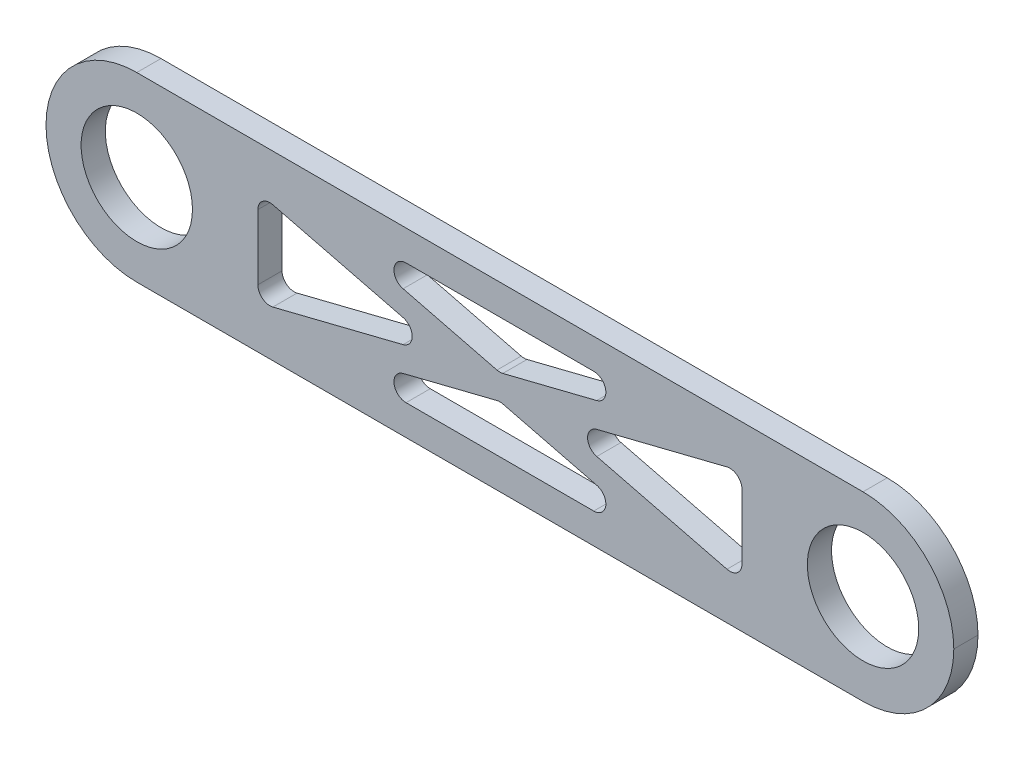
ISO-10303-21;
HEADER;
FILE_DESCRIPTION(('STEP AP214'),'2;1');
FILE_NAME('part.step','',(''),(''),'','','');
FILE_SCHEMA(('AUTOMOTIVE_DESIGN { 1 0 10303 214 1 1 1 1 }'));
ENDSEC;
DATA;
#1=APPLICATION_CONTEXT('core data for automotive mechanical design processes');
#2=APPLICATION_PROTOCOL_DEFINITION('international standard','automotive_design',2000,#1);
#3=PRODUCT_CONTEXT('',#1,'mechanical');
#4=PRODUCT('Part','Part','',(#3));
#5=PRODUCT_RELATED_PRODUCT_CATEGORY('part','',(#4));
#6=PRODUCT_DEFINITION_FORMATION('','',#4);
#7=PRODUCT_DEFINITION_CONTEXT('part definition',#1,'design');
#8=PRODUCT_DEFINITION('design','',#6,#7);
#9=PRODUCT_DEFINITION_SHAPE('','',#8);
#10=(LENGTH_UNIT() NAMED_UNIT(*) SI_UNIT(.MILLI.,.METRE.));
#11=(NAMED_UNIT(*) PLANE_ANGLE_UNIT() SI_UNIT($,.RADIAN.));
#12=(NAMED_UNIT(*) SI_UNIT($,.STERADIAN.) SOLID_ANGLE_UNIT());
#13=UNCERTAINTY_MEASURE_WITH_UNIT(LENGTH_MEASURE(1.E-05),#10,'distance_accuracy_value','');
#14=(GEOMETRIC_REPRESENTATION_CONTEXT(3) GLOBAL_UNCERTAINTY_ASSIGNED_CONTEXT((#13)) GLOBAL_UNIT_ASSIGNED_CONTEXT((#10,
#11,#12)) REPRESENTATION_CONTEXT('',''));
#15=CARTESIAN_POINT('',(0.,0.,0.));
#16=DIRECTION('',(0.,0.,1.));
#17=DIRECTION('',(1.,0.,0.));
#18=AXIS2_PLACEMENT_3D('',#15,#16,#17);
#19=CARTESIAN_POINT('',(0.,0.,-2.));
#20=DIRECTION('',(0.,0.,1.));
#21=DIRECTION('',(-1.,0.,0.));
#22=AXIS2_PLACEMENT_3D('',#19,#20,#21);
#23=PLANE('',#22);
#24=DIRECTION('',(0.970142500145332,0.242535625036333,0.));
#25=VECTOR('',#24,1.);
#26=CARTESIAN_POINT('',(-0.242535625036334,0.970142500145335,-2.));
#27=LINE('',#26,#25);
#28=CARTESIAN_POINT('',(-18.7574643749637,-3.6585896873365,-2.));
#29=VERTEX_POINT('',#28);
#30=CARTESIAN_POINT('',(-8.003675626199,-0.970142500145333,-2.));
#31=VERTEX_POINT('',#30);
#32=EDGE_CURVE('E601',#29,#31,#27,.T.);
#33=ORIENTED_EDGE('',*,*,#32,.T.);
#34=CARTESIAN_POINT('',(-8.24621125123533,0.,-2.));
#35=DIRECTION('',(0.,0.,-1.));
#36=DIRECTION('',(-1.,0.,0.));
#37=AXIS2_PLACEMENT_3D('',#34,#35,#36);
#38=CIRCLE('',#37,1.);
#39=CARTESIAN_POINT('',(-8.003675626199,0.970142500145332,-2.));
#40=VERTEX_POINT('',#39);
#41=EDGE_CURVE('E391',#40,#31,#38,.T.);
#42=ORIENTED_EDGE('',*,*,#41,.F.);
#43=DIRECTION('',(0.970142500145332,-0.242535625036333,0.));
#44=VECTOR('',#43,1.);
#45=CARTESIAN_POINT('',(-0.242535625036335,-0.970142500145337,-2.));
#46=LINE('',#45,#44);
#47=CARTESIAN_POINT('',(-18.7574643749637,3.6585896873365,-2.));
#48=VERTEX_POINT('',#47);
#49=EDGE_CURVE('E598',#48,#40,#46,.T.);
#50=ORIENTED_EDGE('',*,*,#49,.F.);
#51=CARTESIAN_POINT('',(-19.,2.68844718719117,-2.));
#52=DIRECTION('',(0.,0.,-1.));
#53=DIRECTION('',(-1.,0.,0.));
#54=AXIS2_PLACEMENT_3D('',#51,#52,#53);
#55=CIRCLE('',#54,1.);
#56=CARTESIAN_POINT('',(-20.,2.68844718719117,-2.));
#57=VERTEX_POINT('',#56);
#58=EDGE_CURVE('E403',#57,#48,#55,.T.);
#59=ORIENTED_EDGE('',*,*,#58,.F.);
#60=DIRECTION('',(0.,1.,0.));
#61=VECTOR('',#60,1.);
#62=CARTESIAN_POINT('',(-20.,0.,-2.));
#63=LINE('',#62,#61);
#64=CARTESIAN_POINT('',(-20.,-2.68844718719117,-2.));
#65=VERTEX_POINT('',#64);
#66=EDGE_CURVE('E604',#65,#57,#63,.T.);
#67=ORIENTED_EDGE('',*,*,#66,.F.);
#68=CARTESIAN_POINT('',(-19.,-2.68844718719117,-2.));
#69=DIRECTION('',(0.,0.,-1.));
#70=DIRECTION('',(-1.,0.,0.));
#71=AXIS2_PLACEMENT_3D('',#68,#69,#70);
#72=CIRCLE('',#71,1.);
#73=EDGE_CURVE('E397',#29,#65,#72,.T.);
#74=ORIENTED_EDGE('',*,*,#73,.F.);
#75=EDGE_LOOP('',(#33,#42,#50,#59,#67,#74));
#76=FACE_BOUND('',#75,.T.);
#77=DIRECTION('',(0.970142500145332,0.242535625036333,0.));
#78=VECTOR('',#77,1.);
#79=CARTESIAN_POINT('',(-0.242535625036334,0.970142500145335,-2.));
#80=LINE('',#79,#78);
#81=CARTESIAN_POINT('',(0.242535625036327,1.0914103126635,-2.));
#82=VERTEX_POINT('',#81);
#83=CARTESIAN_POINT('',(7.996324373801,3.02985749985467,-2.));
#84=VERTEX_POINT('',#83);
#85=EDGE_CURVE('E580',#82,#84,#80,.T.);
#86=ORIENTED_EDGE('',*,*,#85,.T.);
#87=CARTESIAN_POINT('',(7.75378874876466,4.,-2.));
#88=DIRECTION('',(0.,0.,-1.));
#89=DIRECTION('',(-1.,0.,0.));
#90=AXIS2_PLACEMENT_3D('',#87,#88,#89);
#91=CIRCLE('',#90,1.);
#92=CARTESIAN_POINT('',(7.75378874876466,5.,-2.));
#93=VERTEX_POINT('',#92);
#94=EDGE_CURVE('E427',#93,#84,#91,.T.);
#95=ORIENTED_EDGE('',*,*,#94,.F.);
#96=DIRECTION('',(1.,0.,0.));
#97=VECTOR('',#96,1.);
#98=CARTESIAN_POINT('',(0.,5.,-2.));
#99=LINE('',#98,#97);
#100=CARTESIAN_POINT('',(-7.75378874876467,5.,-2.));
#101=VERTEX_POINT('',#100);
#102=EDGE_CURVE('E455',#101,#93,#99,.T.);
#103=ORIENTED_EDGE('',*,*,#102,.F.);
#104=CARTESIAN_POINT('',(-7.75378874876467,4.,-2.));
#105=DIRECTION('',(0.,0.,-1.));
#106=DIRECTION('',(-1.,0.,0.));
#107=AXIS2_PLACEMENT_3D('',#104,#105,#106);
#108=CIRCLE('',#107,1.);
#109=CARTESIAN_POINT('',(-7.99632437380101,3.02985749985467,-2.));
#110=VERTEX_POINT('',#109);
#111=EDGE_CURVE('E421',#110,#101,#108,.T.);
#112=ORIENTED_EDGE('',*,*,#111,.F.);
#113=DIRECTION('',(0.970142500145332,-0.242535625036333,0.));
#114=VECTOR('',#113,1.);
#115=CARTESIAN_POINT('',(0.242535625036333,0.970142500145332,-2.));
#116=LINE('',#115,#114);
#117=CARTESIAN_POINT('',(-0.24253562503634,1.0914103126635,-2.));
#118=VERTEX_POINT('',#117);
#119=EDGE_CURVE('E583',#110,#118,#116,.T.);
#120=ORIENTED_EDGE('',*,*,#119,.T.);
#121=CARTESIAN_POINT('',(0.,2.06155281280883,-2.));
#122=DIRECTION('',(0.,0.,-1.));
#123=DIRECTION('',(-1.,0.,0.));
#124=AXIS2_PLACEMENT_3D('',#121,#122,#123);
#125=CIRCLE('',#124,1.);
#126=EDGE_CURVE('E432',#82,#118,#125,.T.);
#127=ORIENTED_EDGE('',*,*,#126,.F.);
#128=EDGE_LOOP('',(#86,#95,#103,#112,#120,#127));
#129=FACE_BOUND('',#128,.T.);
#130=CARTESIAN_POINT('',(-30.,0.,-2.));
#131=DIRECTION('',(0.,0.,-1.));
#132=DIRECTION('',(-1.,0.,0.));
#133=AXIS2_PLACEMENT_3D('',#130,#131,#132);
#134=CIRCLE('',#133,7.5);
#135=CARTESIAN_POINT('',(-30.,7.5,-2.));
#136=VERTEX_POINT('',#135);
#137=CARTESIAN_POINT('',(-37.5,0.,-2.));
#138=VERTEX_POINT('',#137);
#139=EDGE_CURVE('E280',#136,#138,#134,.F.);
#140=ORIENTED_EDGE('',*,*,#139,.F.);
#141=DIRECTION('',(-1.,0.,0.));
#142=VECTOR('',#141,1.);
#143=CARTESIAN_POINT('',(-37.5,7.5,-2.));
#144=LINE('',#143,#142);
#145=CARTESIAN_POINT('',(30.,7.5,-2.));
#146=VERTEX_POINT('',#145);
#147=EDGE_CURVE('E469',#146,#136,#144,.T.);
#148=ORIENTED_EDGE('',*,*,#147,.F.);
#149=CARTESIAN_POINT('',(30.,0.,-2.));
#150=DIRECTION('',(0.,0.,-1.));
#151=DIRECTION('',(-1.,0.,0.));
#152=AXIS2_PLACEMENT_3D('',#149,#150,#151);
#153=CIRCLE('',#152,7.5);
#154=CARTESIAN_POINT('',(37.5,0.,-2.));
#155=VERTEX_POINT('',#154);
#156=EDGE_CURVE('E277',#155,#146,#153,.F.);
#157=ORIENTED_EDGE('',*,*,#156,.F.);
#158=CARTESIAN_POINT('',(30.,0.,-2.));
#159=DIRECTION('',(0.,0.,-1.));
#160=DIRECTION('',(-1.,0.,0.));
#161=AXIS2_PLACEMENT_3D('',#158,#159,#160);
#162=CIRCLE('',#161,7.5);
#163=CARTESIAN_POINT('',(30.,-7.5,-2.));
#164=VERTEX_POINT('',#163);
#165=EDGE_CURVE('E243',#164,#155,#162,.F.);
#166=ORIENTED_EDGE('',*,*,#165,.F.);
#167=DIRECTION('',(1.,0.,0.));
#168=VECTOR('',#167,1.);
#169=CARTESIAN_POINT('',(-37.5,-7.5,-2.));
#170=LINE('',#169,#168);
#171=CARTESIAN_POINT('',(-30.,-7.5,-2.));
#172=VERTEX_POINT('',#171);
#173=EDGE_CURVE('E257',#172,#164,#170,.T.);
#174=ORIENTED_EDGE('',*,*,#173,.F.);
#175=CARTESIAN_POINT('',(-30.,0.,-2.));
#176=DIRECTION('',(0.,0.,-1.));
#177=DIRECTION('',(-1.,0.,0.));
#178=AXIS2_PLACEMENT_3D('',#175,#176,#177);
#179=CIRCLE('',#178,7.5);
#180=EDGE_CURVE('E283',#138,#172,#179,.F.);
#181=ORIENTED_EDGE('',*,*,#180,.F.);
#182=EDGE_LOOP('',(#140,#148,#157,#166,#174,#181));
#183=FACE_BOUND('',#182,.T.);
#184=CARTESIAN_POINT('',(30.,0.,-2.));
#185=DIRECTION('',(0.,0.,1.));
#186=DIRECTION('',(1.,0.,0.));
#187=AXIS2_PLACEMENT_3D('',#184,#185,#186);
#188=CIRCLE('',#187,4.6);
#189=CARTESIAN_POINT('',(34.6,0.,-2.));
#190=VERTEX_POINT('',#189);
#191=EDGE_CURVE('E462',#190,#190,#188,.T.);
#192=ORIENTED_EDGE('',*,*,#191,.T.);
#193=EDGE_LOOP('',(#192));
#194=FACE_BOUND('',#193,.T.);
#195=CARTESIAN_POINT('',(-30.,0.,-2.));
#196=DIRECTION('',(0.,0.,1.));
#197=DIRECTION('',(1.,0.,0.));
#198=AXIS2_PLACEMENT_3D('',#195,#196,#197);
#199=CIRCLE('',#198,4.6);
#200=CARTESIAN_POINT('',(-25.4,0.,-2.));
#201=VERTEX_POINT('',#200);
#202=EDGE_CURVE('E452',#201,#201,#199,.T.);
#203=ORIENTED_EDGE('',*,*,#202,.T.);
#204=EDGE_LOOP('',(#203));
#205=FACE_BOUND('',#204,.T.);
#206=DIRECTION('',(0.970142500145332,-0.242535625036333,0.));
#207=VECTOR('',#206,1.);
#208=CARTESIAN_POINT('',(0.242535625036333,0.970142500145333,-2.));
#209=LINE('',#208,#207);
#210=CARTESIAN_POINT('',(8.00367562619899,-0.970142500145332,-2.));
#211=VERTEX_POINT('',#210);
#212=CARTESIAN_POINT('',(18.7574643749637,-3.6585896873365,-2.));
#213=VERTEX_POINT('',#212);
#214=EDGE_CURVE('E445',#211,#213,#209,.T.);
#215=ORIENTED_EDGE('',*,*,#214,.T.);
#216=CARTESIAN_POINT('',(19.,-2.68844718719117,-2.));
#217=DIRECTION('',(0.,0.,-1.));
#218=DIRECTION('',(-1.,0.,0.));
#219=AXIS2_PLACEMENT_3D('',#216,#217,#218);
#220=CIRCLE('',#219,1.);
#221=CARTESIAN_POINT('',(20.,-2.68844718719117,-2.));
#222=VERTEX_POINT('',#221);
#223=EDGE_CURVE('E45',#222,#213,#220,.T.);
#224=ORIENTED_EDGE('',*,*,#223,.F.);
#225=DIRECTION('',(0.,1.,0.));
#226=VECTOR('',#225,1.);
#227=CARTESIAN_POINT('',(20.,0.,-2.));
#228=LINE('',#227,#226);
#229=CARTESIAN_POINT('',(20.,2.68844718719117,-2.));
#230=VERTEX_POINT('',#229);
#231=EDGE_CURVE('E449',#222,#230,#228,.T.);
#232=ORIENTED_EDGE('',*,*,#231,.T.);
#233=CARTESIAN_POINT('',(19.,2.68844718719117,-2.));
#234=DIRECTION('',(0.,0.,-1.));
#235=DIRECTION('',(-1.,0.,0.));
#236=AXIS2_PLACEMENT_3D('',#233,#234,#235);
#237=CIRCLE('',#236,1.);
#238=CARTESIAN_POINT('',(18.7574643749637,3.6585896873365,-2.));
#239=VERTEX_POINT('',#238);
#240=EDGE_CURVE('E415',#239,#230,#237,.T.);
#241=ORIENTED_EDGE('',*,*,#240,.F.);
#242=DIRECTION('',(0.970142500145332,0.242535625036333,0.));
#243=VECTOR('',#242,1.);
#244=CARTESIAN_POINT('',(0.242535625036333,-0.970142500145333,-2.));
#245=LINE('',#244,#243);
#246=CARTESIAN_POINT('',(8.00367562619899,0.970142500145332,-2.));
#247=VERTEX_POINT('',#246);
#248=EDGE_CURVE('E450',#247,#239,#245,.T.);
#249=ORIENTED_EDGE('',*,*,#248,.F.);
#250=CARTESIAN_POINT('',(8.24621125123532,0.,-2.));
#251=DIRECTION('',(0.,0.,-1.));
#252=DIRECTION('',(-1.,0.,0.));
#253=AXIS2_PLACEMENT_3D('',#250,#251,#252);
#254=CIRCLE('',#253,1.);
#255=EDGE_CURVE('E409',#211,#247,#254,.T.);
#256=ORIENTED_EDGE('',*,*,#255,.F.);
#257=EDGE_LOOP('',(#215,#224,#232,#241,#249,#256));
#258=FACE_BOUND('',#257,.T.);
#259=DIRECTION('',(0.970142500145332,0.242535625036333,0.));
#260=VECTOR('',#259,1.);
#261=CARTESIAN_POINT('',(0.242535625036333,-0.970142500145332,-2.));
#262=LINE('',#261,#260);
#263=CARTESIAN_POINT('',(-7.99632437380101,-3.02985749985467,-2.));
#264=VERTEX_POINT('',#263);
#265=CARTESIAN_POINT('',(-0.242535625036342,-1.0914103126635,-2.));
#266=VERTEX_POINT('',#265);
#267=EDGE_CURVE('E592',#264,#266,#262,.T.);
#268=ORIENTED_EDGE('',*,*,#267,.F.);
#269=CARTESIAN_POINT('',(-7.75378874876467,-4.,-2.));
#270=DIRECTION('',(0.,0.,-1.));
#271=DIRECTION('',(-1.,0.,0.));
#272=AXIS2_PLACEMENT_3D('',#269,#270,#271);
#273=CIRCLE('',#272,1.);
#274=CARTESIAN_POINT('',(-7.75378874876467,-5.,-2.));
#275=VERTEX_POINT('',#274);
#276=EDGE_CURVE('E373',#275,#264,#273,.T.);
#277=ORIENTED_EDGE('',*,*,#276,.F.);
#278=DIRECTION('',(1.,0.,0.));
#279=VECTOR('',#278,1.);
#280=CARTESIAN_POINT('',(0.,-5.,-2.));
#281=LINE('',#280,#279);
#282=CARTESIAN_POINT('',(7.75378874876465,-5.,-2.));
#283=VERTEX_POINT('',#282);
#284=EDGE_CURVE('E587',#275,#283,#281,.T.);
#285=ORIENTED_EDGE('',*,*,#284,.T.);
#286=CARTESIAN_POINT('',(7.75378874876465,-4.,-2.));
#287=DIRECTION('',(0.,0.,-1.));
#288=DIRECTION('',(-1.,0.,0.));
#289=AXIS2_PLACEMENT_3D('',#286,#287,#288);
#290=CIRCLE('',#289,1.);
#291=CARTESIAN_POINT('',(7.99632437380098,-3.02985749985467,-2.));
#292=VERTEX_POINT('',#291);
#293=EDGE_CURVE('E385',#292,#283,#290,.T.);
#294=ORIENTED_EDGE('',*,*,#293,.F.);
#295=DIRECTION('',(0.970142500145332,-0.242535625036333,0.));
#296=VECTOR('',#295,1.);
#297=CARTESIAN_POINT('',(-0.242535625036334,-0.970142500145336,-2.));
#298=LINE('',#297,#296);
#299=CARTESIAN_POINT('',(0.242535625036324,-1.0914103126635,-2.));
#300=VERTEX_POINT('',#299);
#301=EDGE_CURVE('E595',#300,#292,#298,.T.);
#302=ORIENTED_EDGE('',*,*,#301,.F.);
#303=CARTESIAN_POINT('',(0.,-2.06155281280883,-2.));
#304=DIRECTION('',(0.,0.,-1.));
#305=DIRECTION('',(-1.,0.,0.));
#306=AXIS2_PLACEMENT_3D('',#303,#304,#305);
#307=CIRCLE('',#306,1.);
#308=EDGE_CURVE('E379',#266,#300,#307,.T.);
#309=ORIENTED_EDGE('',*,*,#308,.F.);
#310=EDGE_LOOP('',(#268,#277,#285,#294,#302,#309));
#311=FACE_BOUND('',#310,.T.);
#312=ADVANCED_FACE('F37',(#76,#129,#183,#194,#205,#258,#311),#23,.F.);
#313=CARTESIAN_POINT('',(0.,0.,0.));
#314=DIRECTION('',(0.,0.,1.));
#315=DIRECTION('',(-1.,0.,0.));
#316=AXIS2_PLACEMENT_3D('',#313,#314,#315);
#317=PLANE('',#316);
#318=DIRECTION('',(-0.970142500145332,0.242535625036333,0.));
#319=VECTOR('',#318,1.);
#320=CARTESIAN_POINT('',(0.242535625036333,0.970142500145332,0.));
#321=LINE('',#320,#319);
#322=CARTESIAN_POINT('',(-0.24253562503634,1.0914103126635,0.));
#323=VERTEX_POINT('',#322);
#324=CARTESIAN_POINT('',(-7.99632437380101,3.02985749985467,0.));
#325=VERTEX_POINT('',#324);
#326=EDGE_CURVE('E306',#323,#325,#321,.T.);
#327=ORIENTED_EDGE('',*,*,#326,.T.);
#328=CARTESIAN_POINT('',(-7.75378874876467,4.,0.));
#329=DIRECTION('',(0.,0.,-1.));
#330=DIRECTION('',(-1.,0.,0.));
#331=AXIS2_PLACEMENT_3D('',#328,#329,#330);
#332=CIRCLE('',#331,1.);
#333=CARTESIAN_POINT('',(-7.75378874876467,5.,0.));
#334=VERTEX_POINT('',#333);
#335=EDGE_CURVE('E424',#334,#325,#332,.F.);
#336=ORIENTED_EDGE('',*,*,#335,.F.);
#337=DIRECTION('',(-1.,0.,0.));
#338=VECTOR('',#337,1.);
#339=CARTESIAN_POINT('',(0.,5.,0.));
#340=LINE('',#339,#338);
#341=CARTESIAN_POINT('',(7.75378874876466,5.,0.));
#342=VERTEX_POINT('',#341);
#343=EDGE_CURVE('E303',#342,#334,#340,.T.);
#344=ORIENTED_EDGE('',*,*,#343,.F.);
#345=CARTESIAN_POINT('',(7.75378874876466,4.,0.));
#346=DIRECTION('',(0.,0.,-1.));
#347=DIRECTION('',(-1.,0.,0.));
#348=AXIS2_PLACEMENT_3D('',#345,#346,#347);
#349=CIRCLE('',#348,1.);
#350=CARTESIAN_POINT('',(7.996324373801,3.02985749985467,0.));
#351=VERTEX_POINT('',#350);
#352=EDGE_CURVE('E429',#351,#342,#349,.F.);
#353=ORIENTED_EDGE('',*,*,#352,.F.);
#354=DIRECTION('',(-0.970142500145332,-0.242535625036333,0.));
#355=VECTOR('',#354,1.);
#356=CARTESIAN_POINT('',(-0.242535625036334,0.970142500145335,0.));
#357=LINE('',#356,#355);
#358=CARTESIAN_POINT('',(0.242535625036327,1.0914103126635,0.));
#359=VERTEX_POINT('',#358);
#360=EDGE_CURVE('E300',#351,#359,#357,.T.);
#361=ORIENTED_EDGE('',*,*,#360,.T.);
#362=CARTESIAN_POINT('',(0.,2.06155281280883,0.));
#363=DIRECTION('',(0.,0.,-1.));
#364=DIRECTION('',(-1.,0.,0.));
#365=AXIS2_PLACEMENT_3D('',#362,#363,#364);
#366=CIRCLE('',#365,1.);
#367=EDGE_CURVE('E434',#323,#359,#366,.F.);
#368=ORIENTED_EDGE('',*,*,#367,.F.);
#369=EDGE_LOOP('',(#327,#336,#344,#353,#361,#368));
#370=FACE_BOUND('',#369,.T.);
#371=CARTESIAN_POINT('',(-30.,0.,0.));
#372=DIRECTION('',(0.,0.,1.));
#373=DIRECTION('',(1.,0.,0.));
#374=AXIS2_PLACEMENT_3D('',#371,#372,#373);
#375=CIRCLE('',#374,4.6);
#376=CARTESIAN_POINT('',(-25.4,0.,0.));
#377=VERTEX_POINT('',#376);
#378=EDGE_CURVE('E459',#377,#377,#375,.T.);
#379=ORIENTED_EDGE('',*,*,#378,.F.);
#380=EDGE_LOOP('',(#379));
#381=FACE_BOUND('',#380,.T.);
#382=CARTESIAN_POINT('',(30.,0.,0.));
#383=DIRECTION('',(0.,0.,1.));
#384=DIRECTION('',(1.,0.,0.));
#385=AXIS2_PLACEMENT_3D('',#382,#383,#384);
#386=CIRCLE('',#385,4.6);
#387=CARTESIAN_POINT('',(34.6,0.,0.));
#388=VERTEX_POINT('',#387);
#389=EDGE_CURVE('E291',#388,#388,#386,.T.);
#390=ORIENTED_EDGE('',*,*,#389,.F.);
#391=EDGE_LOOP('',(#390));
#392=FACE_BOUND('',#391,.T.);
#393=DIRECTION('',(1.,0.,0.));
#394=VECTOR('',#393,1.);
#395=CARTESIAN_POINT('',(-37.5,-7.5,0.));
#396=LINE('',#395,#394);
#397=CARTESIAN_POINT('',(-30.,-7.5,0.));
#398=VERTEX_POINT('',#397);
#399=CARTESIAN_POINT('',(30.,-7.5,0.));
#400=VERTEX_POINT('',#399);
#401=EDGE_CURVE('E263',#398,#400,#396,.T.);
#402=ORIENTED_EDGE('',*,*,#401,.T.);
#403=CARTESIAN_POINT('',(30.,0.,0.));
#404=DIRECTION('',(0.,0.,-1.));
#405=DIRECTION('',(-1.,0.,0.));
#406=AXIS2_PLACEMENT_3D('',#403,#404,#405);
#407=CIRCLE('',#406,7.5);
#408=CARTESIAN_POINT('',(37.5,0.,0.));
#409=VERTEX_POINT('',#408);
#410=EDGE_CURVE('E240',#409,#400,#407,.T.);
#411=ORIENTED_EDGE('',*,*,#410,.F.);
#412=CARTESIAN_POINT('',(30.,0.,0.));
#413=DIRECTION('',(0.,0.,-1.));
#414=DIRECTION('',(-1.,0.,0.));
#415=AXIS2_PLACEMENT_3D('',#412,#413,#414);
#416=CIRCLE('',#415,7.5);
#417=CARTESIAN_POINT('',(30.,7.5,0.));
#418=VERTEX_POINT('',#417);
#419=EDGE_CURVE('E251',#418,#409,#416,.T.);
#420=ORIENTED_EDGE('',*,*,#419,.F.);
#421=DIRECTION('',(-1.,0.,0.));
#422=VECTOR('',#421,1.);
#423=CARTESIAN_POINT('',(-37.5,7.5,0.));
#424=LINE('',#423,#422);
#425=CARTESIAN_POINT('',(-30.,7.5,0.));
#426=VERTEX_POINT('',#425);
#427=EDGE_CURVE('E247',#418,#426,#424,.T.);
#428=ORIENTED_EDGE('',*,*,#427,.T.);
#429=CARTESIAN_POINT('',(-30.,0.,0.));
#430=DIRECTION('',(0.,0.,-1.));
#431=DIRECTION('',(-1.,0.,0.));
#432=AXIS2_PLACEMENT_3D('',#429,#430,#431);
#433=CIRCLE('',#432,7.5);
#434=CARTESIAN_POINT('',(-37.5,0.,0.));
#435=VERTEX_POINT('',#434);
#436=EDGE_CURVE('E264',#435,#426,#433,.T.);
#437=ORIENTED_EDGE('',*,*,#436,.F.);
#438=CARTESIAN_POINT('',(-30.,0.,0.));
#439=DIRECTION('',(0.,0.,-1.));
#440=DIRECTION('',(-1.,0.,0.));
#441=AXIS2_PLACEMENT_3D('',#438,#439,#440);
#442=CIRCLE('',#441,7.5);
#443=EDGE_CURVE('E267',#398,#435,#442,.T.);
#444=ORIENTED_EDGE('',*,*,#443,.F.);
#445=EDGE_LOOP('',(#402,#411,#420,#428,#437,#444));
#446=FACE_BOUND('',#445,.T.);
#447=DIRECTION('',(0.,-1.,0.));
#448=VECTOR('',#447,1.);
#449=CARTESIAN_POINT('',(20.,0.,0.));
#450=LINE('',#449,#448);
#451=CARTESIAN_POINT('',(20.,2.68844718719117,0.));
#452=VERTEX_POINT('',#451);
#453=CARTESIAN_POINT('',(20.,-2.68844718719117,0.));
#454=VERTEX_POINT('',#453);
#455=EDGE_CURVE('E294',#452,#454,#450,.T.);
#456=ORIENTED_EDGE('',*,*,#455,.T.);
#457=CARTESIAN_POINT('',(19.,-2.68844718719117,0.));
#458=DIRECTION('',(0.,0.,-1.));
#459=DIRECTION('',(-1.,0.,0.));
#460=AXIS2_PLACEMENT_3D('',#457,#458,#459);
#461=CIRCLE('',#460,1.);
#462=CARTESIAN_POINT('',(18.7574643749637,-3.6585896873365,0.));
#463=VERTEX_POINT('',#462);
#464=EDGE_CURVE('E11',#463,#454,#461,.F.);
#465=ORIENTED_EDGE('',*,*,#464,.F.);
#466=DIRECTION('',(-0.970142500145332,0.242535625036333,0.));
#467=VECTOR('',#466,1.);
#468=CARTESIAN_POINT('',(0.242535625036333,0.970142500145333,0.));
#469=LINE('',#468,#467);
#470=CARTESIAN_POINT('',(8.00367562619899,-0.970142500145332,0.));
#471=VERTEX_POINT('',#470);
#472=EDGE_CURVE('E288',#463,#471,#469,.T.);
#473=ORIENTED_EDGE('',*,*,#472,.T.);
#474=CARTESIAN_POINT('',(8.24621125123532,0.,0.));
#475=DIRECTION('',(0.,0.,-1.));
#476=DIRECTION('',(-1.,0.,0.));
#477=AXIS2_PLACEMENT_3D('',#474,#475,#476);
#478=CIRCLE('',#477,1.);
#479=CARTESIAN_POINT('',(8.00367562619899,0.970142500145332,0.));
#480=VERTEX_POINT('',#479);
#481=EDGE_CURVE('E412',#480,#471,#478,.F.);
#482=ORIENTED_EDGE('',*,*,#481,.F.);
#483=DIRECTION('',(-0.970142500145332,-0.242535625036333,0.));
#484=VECTOR('',#483,1.);
#485=CARTESIAN_POINT('',(0.242535625036333,-0.970142500145333,0.));
#486=LINE('',#485,#484);
#487=CARTESIAN_POINT('',(18.7574643749637,3.6585896873365,0.));
#488=VERTEX_POINT('',#487);
#489=EDGE_CURVE('E297',#488,#480,#486,.T.);
#490=ORIENTED_EDGE('',*,*,#489,.F.);
#491=CARTESIAN_POINT('',(19.,2.68844718719117,0.));
#492=DIRECTION('',(0.,0.,-1.));
#493=DIRECTION('',(-1.,0.,0.));
#494=AXIS2_PLACEMENT_3D('',#491,#492,#493);
#495=CIRCLE('',#494,1.);
#496=EDGE_CURVE('E418',#452,#488,#495,.F.);
#497=ORIENTED_EDGE('',*,*,#496,.F.);
#498=EDGE_LOOP('',(#456,#465,#473,#482,#490,#497));
#499=FACE_BOUND('',#498,.T.);
#500=DIRECTION('',(-0.970142500145332,-0.242535625036333,0.));
#501=VECTOR('',#500,1.);
#502=CARTESIAN_POINT('',(-0.242535625036334,0.970142500145335,0.));
#503=LINE('',#502,#501);
#504=CARTESIAN_POINT('',(-8.003675626199,-0.970142500145333,0.));
#505=VERTEX_POINT('',#504);
#506=CARTESIAN_POINT('',(-18.7574643749637,-3.6585896873365,0.));
#507=VERTEX_POINT('',#506);
#508=EDGE_CURVE('E309',#505,#507,#503,.T.);
#509=ORIENTED_EDGE('',*,*,#508,.T.);
#510=CARTESIAN_POINT('',(-19.,-2.68844718719117,0.));
#511=DIRECTION('',(0.,0.,-1.));
#512=DIRECTION('',(-1.,0.,0.));
#513=AXIS2_PLACEMENT_3D('',#510,#511,#512);
#514=CIRCLE('',#513,1.);
#515=CARTESIAN_POINT('',(-20.,-2.68844718719117,0.));
#516=VERTEX_POINT('',#515);
#517=EDGE_CURVE('E400',#516,#507,#514,.F.);
#518=ORIENTED_EDGE('',*,*,#517,.F.);
#519=DIRECTION('',(0.,-1.,0.));
#520=VECTOR('',#519,1.);
#521=CARTESIAN_POINT('',(-20.,0.,0.));
#522=LINE('',#521,#520);
#523=CARTESIAN_POINT('',(-20.,2.68844718719117,0.));
#524=VERTEX_POINT('',#523);
#525=EDGE_CURVE('E315',#524,#516,#522,.T.);
#526=ORIENTED_EDGE('',*,*,#525,.F.);
#527=CARTESIAN_POINT('',(-19.,2.68844718719117,0.));
#528=DIRECTION('',(0.,0.,-1.));
#529=DIRECTION('',(-1.,0.,0.));
#530=AXIS2_PLACEMENT_3D('',#527,#528,#529);
#531=CIRCLE('',#530,1.);
#532=CARTESIAN_POINT('',(-18.7574643749637,3.6585896873365,0.));
#533=VERTEX_POINT('',#532);
#534=EDGE_CURVE('E406',#533,#524,#531,.F.);
#535=ORIENTED_EDGE('',*,*,#534,.F.);
#536=DIRECTION('',(-0.970142500145332,0.242535625036333,0.));
#537=VECTOR('',#536,1.);
#538=CARTESIAN_POINT('',(-0.242535625036335,-0.970142500145337,0.));
#539=LINE('',#538,#537);
#540=CARTESIAN_POINT('',(-8.003675626199,0.970142500145332,0.));
#541=VERTEX_POINT('',#540);
#542=EDGE_CURVE('E312',#541,#533,#539,.T.);
#543=ORIENTED_EDGE('',*,*,#542,.F.);
#544=CARTESIAN_POINT('',(-8.24621125123533,0.,0.));
#545=DIRECTION('',(0.,0.,-1.));
#546=DIRECTION('',(-1.,0.,0.));
#547=AXIS2_PLACEMENT_3D('',#544,#545,#546);
#548=CIRCLE('',#547,1.);
#549=EDGE_CURVE('E394',#505,#541,#548,.F.);
#550=ORIENTED_EDGE('',*,*,#549,.F.);
#551=EDGE_LOOP('',(#509,#518,#526,#535,#543,#550));
#552=FACE_BOUND('',#551,.T.);
#553=DIRECTION('',(-1.,0.,0.));
#554=VECTOR('',#553,1.);
#555=CARTESIAN_POINT('',(0.,-5.,0.));
#556=LINE('',#555,#554);
#557=CARTESIAN_POINT('',(7.75378874876465,-5.,0.));
#558=VERTEX_POINT('',#557);
#559=CARTESIAN_POINT('',(-7.75378874876467,-5.,0.));
#560=VERTEX_POINT('',#559);
#561=EDGE_CURVE('E321',#558,#560,#556,.T.);
#562=ORIENTED_EDGE('',*,*,#561,.T.);
#563=CARTESIAN_POINT('',(-7.75378874876467,-4.,0.));
#564=DIRECTION('',(0.,0.,-1.));
#565=DIRECTION('',(-1.,0.,0.));
#566=AXIS2_PLACEMENT_3D('',#563,#564,#565);
#567=CIRCLE('',#566,1.);
#568=CARTESIAN_POINT('',(-7.99632437380101,-3.02985749985467,0.));
#569=VERTEX_POINT('',#568);
#570=EDGE_CURVE('E376',#569,#560,#567,.F.);
#571=ORIENTED_EDGE('',*,*,#570,.F.);
#572=DIRECTION('',(-0.970142500145332,-0.242535625036333,0.));
#573=VECTOR('',#572,1.);
#574=CARTESIAN_POINT('',(0.242535625036333,-0.970142500145332,0.));
#575=LINE('',#574,#573);
#576=CARTESIAN_POINT('',(-0.242535625036342,-1.0914103126635,0.));
#577=VERTEX_POINT('',#576);
#578=EDGE_CURVE('E318',#577,#569,#575,.T.);
#579=ORIENTED_EDGE('',*,*,#578,.F.);
#580=CARTESIAN_POINT('',(0.,-2.06155281280883,0.));
#581=DIRECTION('',(0.,0.,-1.));
#582=DIRECTION('',(-1.,0.,0.));
#583=AXIS2_PLACEMENT_3D('',#580,#581,#582);
#584=CIRCLE('',#583,1.);
#585=CARTESIAN_POINT('',(0.242535625036325,-1.0914103126635,0.));
#586=VERTEX_POINT('',#585);
#587=EDGE_CURVE('E382',#586,#577,#584,.F.);
#588=ORIENTED_EDGE('',*,*,#587,.F.);
#589=DIRECTION('',(-0.970142500145332,0.242535625036333,0.));
#590=VECTOR('',#589,1.);
#591=CARTESIAN_POINT('',(-0.242535625036334,-0.970142500145336,0.));
#592=LINE('',#591,#590);
#593=CARTESIAN_POINT('',(7.99632437380098,-3.02985749985467,0.));
#594=VERTEX_POINT('',#593);
#595=EDGE_CURVE('E324',#594,#586,#592,.T.);
#596=ORIENTED_EDGE('',*,*,#595,.F.);
#597=CARTESIAN_POINT('',(7.75378874876465,-4.,0.));
#598=DIRECTION('',(0.,0.,-1.));
#599=DIRECTION('',(-1.,0.,0.));
#600=AXIS2_PLACEMENT_3D('',#597,#598,#599);
#601=CIRCLE('',#600,1.);
#602=EDGE_CURVE('E388',#558,#594,#601,.F.);
#603=ORIENTED_EDGE('',*,*,#602,.F.);
#604=EDGE_LOOP('',(#562,#571,#579,#588,#596,#603));
#605=FACE_BOUND('',#604,.T.);
#606=ADVANCED_FACE('F259',(#370,#381,#392,#446,#499,#552,#605),#317,.T.);
#607=CARTESIAN_POINT('',(-37.5,7.5,-2.));
#608=DIRECTION('',(0.,-1.,0.));
#609=DIRECTION('',(0.,0.,1.));
#610=AXIS2_PLACEMENT_3D('',#607,#608,#609);
#611=PLANE('',#610);
#612=ORIENTED_EDGE('',*,*,#427,.F.);
#613=DIRECTION('',(0.,0.,1.));
#614=VECTOR('',#613,1.);
#615=CARTESIAN_POINT('',(30.,7.5,-2.));
#616=LINE('',#615,#614);
#617=EDGE_CURVE('E253',#146,#418,#616,.T.);
#618=ORIENTED_EDGE('',*,*,#617,.F.);
#619=ORIENTED_EDGE('',*,*,#147,.T.);
#620=DIRECTION('',(0.,0.,1.));
#621=VECTOR('',#620,1.);
#622=CARTESIAN_POINT('',(-30.,7.5,-2.));
#623=LINE('',#622,#621);
#624=EDGE_CURVE('E287',#426,#136,#623,.F.);
#625=ORIENTED_EDGE('',*,*,#624,.F.);
#626=EDGE_LOOP('',(#612,#618,#619,#625));
#627=FACE_BOUND('',#626,.T.);
#628=ADVANCED_FACE('F476',(#627),#611,.F.);
#629=CARTESIAN_POINT('',(-37.5,-7.5,-2.));
#630=DIRECTION('',(0.,1.,0.));
#631=DIRECTION('',(0.,0.,-1.));
#632=AXIS2_PLACEMENT_3D('',#629,#630,#631);
#633=PLANE('',#632);
#634=ORIENTED_EDGE('',*,*,#401,.F.);
#635=DIRECTION('',(0.,0.,1.));
#636=VECTOR('',#635,1.);
#637=CARTESIAN_POINT('',(-30.,-7.5,-2.));
#638=LINE('',#637,#636);
#639=EDGE_CURVE('E273',#172,#398,#638,.T.);
#640=ORIENTED_EDGE('',*,*,#639,.F.);
#641=ORIENTED_EDGE('',*,*,#173,.T.);
#642=DIRECTION('',(0.,0.,1.));
#643=VECTOR('',#642,1.);
#644=CARTESIAN_POINT('',(30.,-7.5,-2.));
#645=LINE('',#644,#643);
#646=EDGE_CURVE('E275',#400,#164,#645,.F.);
#647=ORIENTED_EDGE('',*,*,#646,.F.);
#648=EDGE_LOOP('',(#634,#640,#641,#647));
#649=FACE_BOUND('',#648,.T.);
#650=ADVANCED_FACE('F485',(#649),#633,.F.);
#651=CARTESIAN_POINT('',(30.,0.,-2.));
#652=DIRECTION('',(0.,0.,1.));
#653=DIRECTION('',(-1.,0.,0.));
#654=AXIS2_PLACEMENT_3D('',#651,#652,#653);
#655=CYLINDRICAL_SURFACE('',#654,7.5);
#656=ORIENTED_EDGE('',*,*,#617,.T.);
#657=ORIENTED_EDGE('',*,*,#419,.T.);
#658=DIRECTION('',(0.,0.,1.));
#659=VECTOR('',#658,1.);
#660=CARTESIAN_POINT('',(37.5,0.,-2.));
#661=LINE('',#660,#659);
#662=EDGE_CURVE('E236',#409,#155,#661,.F.);
#663=ORIENTED_EDGE('',*,*,#662,.T.);
#664=ORIENTED_EDGE('',*,*,#156,.T.);
#665=EDGE_LOOP('',(#656,#657,#663,#664));
#666=FACE_BOUND('',#665,.T.);
#667=ADVANCED_FACE('F252',(#666),#655,.T.);
#668=CARTESIAN_POINT('',(30.,0.,-2.));
#669=DIRECTION('',(0.,0.,1.));
#670=DIRECTION('',(-1.,0.,0.));
#671=AXIS2_PLACEMENT_3D('',#668,#669,#670);
#672=CYLINDRICAL_SURFACE('',#671,7.5);
#673=ORIENTED_EDGE('',*,*,#165,.T.);
#674=ORIENTED_EDGE('',*,*,#662,.F.);
#675=ORIENTED_EDGE('',*,*,#410,.T.);
#676=ORIENTED_EDGE('',*,*,#646,.T.);
#677=EDGE_LOOP('',(#673,#674,#675,#676));
#678=FACE_BOUND('',#677,.T.);
#679=ADVANCED_FACE('F238',(#678),#672,.T.);
#680=CARTESIAN_POINT('',(-30.,0.,-2.));
#681=DIRECTION('',(0.,0.,1.));
#682=DIRECTION('',(-1.,0.,0.));
#683=AXIS2_PLACEMENT_3D('',#680,#681,#682);
#684=CYLINDRICAL_SURFACE('',#683,7.5);
#685=DIRECTION('',(0.,0.,1.));
#686=VECTOR('',#685,1.);
#687=CARTESIAN_POINT('',(-37.5,0.,-2.));
#688=LINE('',#687,#686);
#689=EDGE_CURVE('E248',#138,#435,#688,.T.);
#690=ORIENTED_EDGE('',*,*,#689,.T.);
#691=ORIENTED_EDGE('',*,*,#436,.T.);
#692=ORIENTED_EDGE('',*,*,#624,.T.);
#693=ORIENTED_EDGE('',*,*,#139,.T.);
#694=EDGE_LOOP('',(#690,#691,#692,#693));
#695=FACE_BOUND('',#694,.T.);
#696=ADVANCED_FACE('F480',(#695),#684,.T.);
#697=CARTESIAN_POINT('',(-30.,0.,-2.));
#698=DIRECTION('',(0.,0.,1.));
#699=DIRECTION('',(-1.,0.,0.));
#700=AXIS2_PLACEMENT_3D('',#697,#698,#699);
#701=CYLINDRICAL_SURFACE('',#700,7.5);
#702=ORIENTED_EDGE('',*,*,#180,.T.);
#703=ORIENTED_EDGE('',*,*,#639,.T.);
#704=ORIENTED_EDGE('',*,*,#443,.T.);
#705=ORIENTED_EDGE('',*,*,#689,.F.);
#706=EDGE_LOOP('',(#702,#703,#704,#705));
#707=FACE_BOUND('',#706,.T.);
#708=ADVANCED_FACE('F483',(#707),#701,.T.);
#709=CARTESIAN_POINT('',(30.,0.,0.));
#710=DIRECTION('',(0.,0.,-1.));
#711=DIRECTION('',(1.,0.,0.));
#712=AXIS2_PLACEMENT_3D('',#709,#710,#711);
#713=CYLINDRICAL_SURFACE('',#712,4.6);
#714=ORIENTED_EDGE('',*,*,#389,.T.);
#715=EDGE_LOOP('',(#714));
#716=FACE_BOUND('',#715,.T.);
#717=ORIENTED_EDGE('',*,*,#191,.F.);
#718=EDGE_LOOP('',(#717));
#719=FACE_BOUND('',#718,.T.);
#720=ADVANCED_FACE('F499',(#716,#719),#713,.F.);
#721=CARTESIAN_POINT('',(-30.,0.,0.));
#722=DIRECTION('',(0.,0.,-1.));
#723=DIRECTION('',(1.,0.,0.));
#724=AXIS2_PLACEMENT_3D('',#721,#722,#723);
#725=CYLINDRICAL_SURFACE('',#724,4.6);
#726=ORIENTED_EDGE('',*,*,#378,.T.);
#727=EDGE_LOOP('',(#726));
#728=FACE_BOUND('',#727,.T.);
#729=ORIENTED_EDGE('',*,*,#202,.F.);
#730=EDGE_LOOP('',(#729));
#731=FACE_BOUND('',#730,.T.);
#732=ADVANCED_FACE('F496',(#728,#731),#725,.F.);
#733=CARTESIAN_POINT('',(0.242535625036333,-0.970142500145333,8.));
#734=DIRECTION('',(0.242535625036333,-0.970142500145332,0.));
#735=DIRECTION('',(0.970142500145332,0.242535625036333,0.));
#736=AXIS2_PLACEMENT_3D('',#733,#734,#735);
#737=PLANE('',#736);
#738=ORIENTED_EDGE('',*,*,#248,.T.);
#739=DIRECTION('',(0.,0.,-1.));
#740=VECTOR('',#739,1.);
#741=CARTESIAN_POINT('',(18.7574643749637,3.6585896873365,8.));
#742=LINE('',#741,#740);
#743=EDGE_CURVE('E355',#488,#239,#742,.T.);
#744=ORIENTED_EDGE('',*,*,#743,.F.);
#745=ORIENTED_EDGE('',*,*,#489,.T.);
#746=DIRECTION('',(0.,0.,-1.));
#747=VECTOR('',#746,1.);
#748=CARTESIAN_POINT('',(8.00367562619899,0.970142500145331,8.));
#749=LINE('',#748,#747);
#750=EDGE_CURVE('E357',#247,#480,#749,.F.);
#751=ORIENTED_EDGE('',*,*,#750,.F.);
#752=EDGE_LOOP('',(#738,#744,#745,#751));
#753=FACE_BOUND('',#752,.T.);
#754=ADVANCED_FACE('F498',(#753),#737,.T.);
#755=CARTESIAN_POINT('',(20.,0.,8.));
#756=DIRECTION('',(1.,0.,0.));
#757=DIRECTION('',(0.,0.,1.));
#758=AXIS2_PLACEMENT_3D('',#755,#756,#757);
#759=PLANE('',#758);
#760=ORIENTED_EDGE('',*,*,#231,.F.);
#761=DIRECTION('',(0.,0.,-1.));
#762=VECTOR('',#761,1.);
#763=CARTESIAN_POINT('',(20.,-2.68844718719117,-2.));
#764=LINE('',#763,#762);
#765=EDGE_CURVE('E359',#454,#222,#764,.T.);
#766=ORIENTED_EDGE('',*,*,#765,.F.);
#767=ORIENTED_EDGE('',*,*,#455,.F.);
#768=DIRECTION('',(0.,0.,-1.));
#769=VECTOR('',#768,1.);
#770=CARTESIAN_POINT('',(20.,2.68844718719117,8.));
#771=LINE('',#770,#769);
#772=EDGE_CURVE('E361',#230,#452,#771,.F.);
#773=ORIENTED_EDGE('',*,*,#772,.F.);
#774=EDGE_LOOP('',(#760,#766,#767,#773));
#775=FACE_BOUND('',#774,.T.);
#776=ADVANCED_FACE('F506',(#775),#759,.F.);
#777=CARTESIAN_POINT('',(0.242535625036333,0.970142500145333,8.));
#778=DIRECTION('',(-0.242535625036333,-0.970142500145332,0.));
#779=DIRECTION('',(0.970142500145332,-0.242535625036333,0.));
#780=AXIS2_PLACEMENT_3D('',#777,#778,#779);
#781=PLANE('',#780);
#782=ORIENTED_EDGE('',*,*,#472,.F.);
#783=DIRECTION('',(0.,0.,-1.));
#784=VECTOR('',#783,1.);
#785=CARTESIAN_POINT('',(18.7574643749637,-3.6585896873365,0.));
#786=LINE('',#785,#784);
#787=EDGE_CURVE('E351',#213,#463,#786,.F.);
#788=ORIENTED_EDGE('',*,*,#787,.F.);
#789=ORIENTED_EDGE('',*,*,#214,.F.);
#790=DIRECTION('',(0.,0.,-1.));
#791=VECTOR('',#790,1.);
#792=CARTESIAN_POINT('',(8.00367562619899,-0.970142500145331,8.));
#793=LINE('',#792,#791);
#794=EDGE_CURVE('E353',#471,#211,#793,.T.);
#795=ORIENTED_EDGE('',*,*,#794,.F.);
#796=EDGE_LOOP('',(#782,#788,#789,#795));
#797=FACE_BOUND('',#796,.T.);
#798=ADVANCED_FACE('F655',(#797),#781,.F.);
#799=CARTESIAN_POINT('',(0.242535625036333,0.970142500145332,8.));
#800=DIRECTION('',(-0.242535625036333,-0.970142500145332,0.));
#801=DIRECTION('',(0.970142500145332,-0.242535625036333,0.));
#802=AXIS2_PLACEMENT_3D('',#799,#800,#801);
#803=PLANE('',#802);
#804=ORIENTED_EDGE('',*,*,#326,.F.);
#805=DIRECTION('',(0.,0.,-1.));
#806=VECTOR('',#805,1.);
#807=CARTESIAN_POINT('',(-0.24253562503634,1.0914103126635,0.));
#808=LINE('',#807,#806);
#809=EDGE_CURVE('E363',#118,#323,#808,.F.);
#810=ORIENTED_EDGE('',*,*,#809,.F.);
#811=ORIENTED_EDGE('',*,*,#119,.F.);
#812=DIRECTION('',(0.,0.,-1.));
#813=VECTOR('',#812,1.);
#814=CARTESIAN_POINT('',(-7.99632437380101,3.02985749985467,8.));
#815=LINE('',#814,#813);
#816=EDGE_CURVE('E365',#325,#110,#815,.T.);
#817=ORIENTED_EDGE('',*,*,#816,.F.);
#818=EDGE_LOOP('',(#804,#810,#811,#817));
#819=FACE_BOUND('',#818,.T.);
#820=ADVANCED_FACE('F649',(#819),#803,.F.);
#821=CARTESIAN_POINT('',(0.,5.,8.));
#822=DIRECTION('',(0.,-1.,0.));
#823=DIRECTION('',(1.,0.,0.));
#824=AXIS2_PLACEMENT_3D('',#821,#822,#823);
#825=PLANE('',#824);
#826=ORIENTED_EDGE('',*,*,#102,.T.);
#827=DIRECTION('',(0.,0.,-1.));
#828=VECTOR('',#827,1.);
#829=CARTESIAN_POINT('',(7.75378874876466,5.,8.));
#830=LINE('',#829,#828);
#831=EDGE_CURVE('E367',#342,#93,#830,.T.);
#832=ORIENTED_EDGE('',*,*,#831,.F.);
#833=ORIENTED_EDGE('',*,*,#343,.T.);
#834=DIRECTION('',(0.,0.,-1.));
#835=VECTOR('',#834,1.);
#836=CARTESIAN_POINT('',(-7.75378874876467,5.,8.));
#837=LINE('',#836,#835);
#838=EDGE_CURVE('E369',#101,#334,#837,.F.);
#839=ORIENTED_EDGE('',*,*,#838,.F.);
#840=EDGE_LOOP('',(#826,#832,#833,#839));
#841=FACE_BOUND('',#840,.T.);
#842=ADVANCED_FACE('F646',(#841),#825,.T.);
#843=CARTESIAN_POINT('',(-0.242535625036334,0.970142500145335,8.));
#844=DIRECTION('',(0.242535625036333,-0.970142500145332,0.));
#845=DIRECTION('',(0.970142500145332,0.242535625036333,0.));
#846=AXIS2_PLACEMENT_3D('',#843,#844,#845);
#847=PLANE('',#846);
#848=ORIENTED_EDGE('',*,*,#85,.F.);
#849=DIRECTION('',(0.,0.,-1.));
#850=VECTOR('',#849,1.);
#851=CARTESIAN_POINT('',(0.242535625036327,1.0914103126635,-2.));
#852=LINE('',#851,#850);
#853=EDGE_CURVE('E60',#359,#82,#852,.T.);
#854=ORIENTED_EDGE('',*,*,#853,.F.);
#855=ORIENTED_EDGE('',*,*,#360,.F.);
#856=DIRECTION('',(0.,0.,-1.));
#857=VECTOR('',#856,1.);
#858=CARTESIAN_POINT('',(7.996324373801,3.02985749985467,8.));
#859=LINE('',#858,#857);
#860=EDGE_CURVE('E52',#84,#351,#859,.F.);
#861=ORIENTED_EDGE('',*,*,#860,.F.);
#862=EDGE_LOOP('',(#848,#854,#855,#861));
#863=FACE_BOUND('',#862,.T.);
#864=ADVANCED_FACE('F578',(#863),#847,.F.);
#865=CARTESIAN_POINT('',(-20.,0.,8.));
#866=DIRECTION('',(1.,0.,0.));
#867=DIRECTION('',(0.,0.,1.));
#868=AXIS2_PLACEMENT_3D('',#865,#866,#867);
#869=PLANE('',#868);
#870=ORIENTED_EDGE('',*,*,#66,.T.);
#871=DIRECTION('',(0.,0.,-1.));
#872=VECTOR('',#871,1.);
#873=CARTESIAN_POINT('',(-20.,2.68844718719117,-2.));
#874=LINE('',#873,#872);
#875=EDGE_CURVE('E347',#524,#57,#874,.T.);
#876=ORIENTED_EDGE('',*,*,#875,.F.);
#877=ORIENTED_EDGE('',*,*,#525,.T.);
#878=DIRECTION('',(0.,0.,-1.));
#879=VECTOR('',#878,1.);
#880=CARTESIAN_POINT('',(-20.,-2.68844718719117,8.));
#881=LINE('',#880,#879);
#882=EDGE_CURVE('E349',#65,#516,#881,.F.);
#883=ORIENTED_EDGE('',*,*,#882,.F.);
#884=EDGE_LOOP('',(#870,#876,#877,#883));
#885=FACE_BOUND('',#884,.T.);
#886=ADVANCED_FACE('F609',(#885),#869,.T.);
#887=CARTESIAN_POINT('',(-0.242535625036335,-0.970142500145337,8.));
#888=DIRECTION('',(-0.242535625036333,-0.970142500145332,0.));
#889=DIRECTION('',(0.970142500145332,-0.242535625036333,0.));
#890=AXIS2_PLACEMENT_3D('',#887,#888,#889);
#891=PLANE('',#890);
#892=ORIENTED_EDGE('',*,*,#542,.T.);
#893=DIRECTION('',(0.,0.,-1.));
#894=VECTOR('',#893,1.);
#895=CARTESIAN_POINT('',(-18.7574643749637,3.6585896873365,0.));
#896=LINE('',#895,#894);
#897=EDGE_CURVE('E339',#48,#533,#896,.F.);
#898=ORIENTED_EDGE('',*,*,#897,.F.);
#899=ORIENTED_EDGE('',*,*,#49,.T.);
#900=DIRECTION('',(0.,0.,-1.));
#901=VECTOR('',#900,1.);
#902=CARTESIAN_POINT('',(-8.003675626199,0.970142500145331,8.));
#903=LINE('',#902,#901);
#904=EDGE_CURVE('E341',#541,#40,#903,.T.);
#905=ORIENTED_EDGE('',*,*,#904,.F.);
#906=EDGE_LOOP('',(#892,#898,#899,#905));
#907=FACE_BOUND('',#906,.T.);
#908=ADVANCED_FACE('F625',(#907),#891,.T.);
#909=CARTESIAN_POINT('',(-0.242535625036334,0.970142500145335,8.));
#910=DIRECTION('',(0.242535625036333,-0.970142500145332,0.));
#911=DIRECTION('',(0.970142500145332,0.242535625036333,0.));
#912=AXIS2_PLACEMENT_3D('',#909,#910,#911);
#913=PLANE('',#912);
#914=ORIENTED_EDGE('',*,*,#32,.F.);
#915=DIRECTION('',(0.,0.,-1.));
#916=VECTOR('',#915,1.);
#917=CARTESIAN_POINT('',(-18.7574643749637,-3.6585896873365,8.));
#918=LINE('',#917,#916);
#919=EDGE_CURVE('E343',#507,#29,#918,.T.);
#920=ORIENTED_EDGE('',*,*,#919,.F.);
#921=ORIENTED_EDGE('',*,*,#508,.F.);
#922=DIRECTION('',(0.,0.,-1.));
#923=VECTOR('',#922,1.);
#924=CARTESIAN_POINT('',(-8.003675626199,-0.970142500145333,8.));
#925=LINE('',#924,#923);
#926=EDGE_CURVE('E345',#31,#505,#925,.F.);
#927=ORIENTED_EDGE('',*,*,#926,.F.);
#928=EDGE_LOOP('',(#914,#920,#921,#927));
#929=FACE_BOUND('',#928,.T.);
#930=ADVANCED_FACE('F623',(#929),#913,.F.);
#931=CARTESIAN_POINT('',(-0.242535625036334,-0.970142500145336,8.));
#932=DIRECTION('',(-0.242535625036333,-0.970142500145332,0.));
#933=DIRECTION('',(0.970142500145332,-0.242535625036333,0.));
#934=AXIS2_PLACEMENT_3D('',#931,#932,#933);
#935=PLANE('',#934);
#936=ORIENTED_EDGE('',*,*,#301,.T.);
#937=DIRECTION('',(0.,0.,-1.));
#938=VECTOR('',#937,1.);
#939=CARTESIAN_POINT('',(7.99632437380098,-3.02985749985467,8.));
#940=LINE('',#939,#938);
#941=EDGE_CURVE('E335',#594,#292,#940,.T.);
#942=ORIENTED_EDGE('',*,*,#941,.F.);
#943=ORIENTED_EDGE('',*,*,#595,.T.);
#944=DIRECTION('',(0.,0.,-1.));
#945=VECTOR('',#944,1.);
#946=CARTESIAN_POINT('',(0.242535625036324,-1.0914103126635,0.));
#947=LINE('',#946,#945);
#948=EDGE_CURVE('E337',#300,#586,#947,.F.);
#949=ORIENTED_EDGE('',*,*,#948,.F.);
#950=EDGE_LOOP('',(#936,#942,#943,#949));
#951=FACE_BOUND('',#950,.T.);
#952=ADVANCED_FACE('F632',(#951),#935,.T.);
#953=CARTESIAN_POINT('',(0.,-5.,8.));
#954=DIRECTION('',(0.,-1.,0.));
#955=DIRECTION('',(1.,0.,0.));
#956=AXIS2_PLACEMENT_3D('',#953,#954,#955);
#957=PLANE('',#956);
#958=ORIENTED_EDGE('',*,*,#561,.F.);
#959=DIRECTION('',(0.,0.,-1.));
#960=VECTOR('',#959,1.);
#961=CARTESIAN_POINT('',(7.75378874876465,-5.,8.));
#962=LINE('',#961,#960);
#963=EDGE_CURVE('E327',#283,#558,#962,.F.);
#964=ORIENTED_EDGE('',*,*,#963,.F.);
#965=ORIENTED_EDGE('',*,*,#284,.F.);
#966=DIRECTION('',(0.,0.,-1.));
#967=VECTOR('',#966,1.);
#968=CARTESIAN_POINT('',(-7.75378874876467,-5.,8.));
#969=LINE('',#968,#967);
#970=EDGE_CURVE('E329',#560,#275,#969,.T.);
#971=ORIENTED_EDGE('',*,*,#970,.F.);
#972=EDGE_LOOP('',(#958,#964,#965,#971));
#973=FACE_BOUND('',#972,.T.);
#974=ADVANCED_FACE('F636',(#973),#957,.F.);
#975=CARTESIAN_POINT('',(0.242535625036333,-0.970142500145332,8.));
#976=DIRECTION('',(0.242535625036333,-0.970142500145332,0.));
#977=DIRECTION('',(0.970142500145332,0.242535625036333,0.));
#978=AXIS2_PLACEMENT_3D('',#975,#976,#977);
#979=PLANE('',#978);
#980=ORIENTED_EDGE('',*,*,#267,.T.);
#981=DIRECTION('',(0.,0.,-1.));
#982=VECTOR('',#981,1.);
#983=CARTESIAN_POINT('',(-0.242535625036342,-1.0914103126635,-2.));
#984=LINE('',#983,#982);
#985=EDGE_CURVE('E331',#577,#266,#984,.T.);
#986=ORIENTED_EDGE('',*,*,#985,.F.);
#987=ORIENTED_EDGE('',*,*,#578,.T.);
#988=DIRECTION('',(0.,0.,-1.));
#989=VECTOR('',#988,1.);
#990=CARTESIAN_POINT('',(-7.99632437380101,-3.02985749985467,8.));
#991=LINE('',#990,#989);
#992=EDGE_CURVE('E333',#264,#569,#991,.F.);
#993=ORIENTED_EDGE('',*,*,#992,.F.);
#994=EDGE_LOOP('',(#980,#986,#987,#993));
#995=FACE_BOUND('',#994,.T.);
#996=ADVANCED_FACE('F532',(#995),#979,.T.);
#997=CARTESIAN_POINT('',(-7.75378874876467,-4.,8.));
#998=DIRECTION('',(0.,0.,-1.));
#999=DIRECTION('',(1.,0.,0.));
#1000=AXIS2_PLACEMENT_3D('',#997,#998,#999);
#1001=CYLINDRICAL_SURFACE('',#1000,1.);
#1002=ORIENTED_EDGE('',*,*,#570,.T.);
#1003=ORIENTED_EDGE('',*,*,#970,.T.);
#1004=ORIENTED_EDGE('',*,*,#276,.T.);
#1005=ORIENTED_EDGE('',*,*,#992,.T.);
#1006=EDGE_LOOP('',(#1002,#1003,#1004,#1005));
#1007=FACE_BOUND('',#1006,.T.);
#1008=ADVANCED_FACE('F528',(#1007),#1001,.F.);
#1009=CARTESIAN_POINT('',(0.,-2.06155281280883,8.));
#1010=DIRECTION('',(0.,0.,1.));
#1011=DIRECTION('',(-1.,0.,0.));
#1012=AXIS2_PLACEMENT_3D('',#1009,#1010,#1011);
#1013=CYLINDRICAL_SURFACE('',#1012,1.);
#1014=ORIENTED_EDGE('',*,*,#587,.T.);
#1015=ORIENTED_EDGE('',*,*,#985,.T.);
#1016=ORIENTED_EDGE('',*,*,#308,.T.);
#1017=ORIENTED_EDGE('',*,*,#948,.T.);
#1018=EDGE_LOOP('',(#1014,#1015,#1016,#1017));
#1019=FACE_BOUND('',#1018,.T.);
#1020=ADVANCED_FACE('F531',(#1019),#1013,.F.);
#1021=CARTESIAN_POINT('',(7.75378874876465,-4.,8.));
#1022=DIRECTION('',(0.,0.,-1.));
#1023=DIRECTION('',(1.,0.,0.));
#1024=AXIS2_PLACEMENT_3D('',#1021,#1022,#1023);
#1025=CYLINDRICAL_SURFACE('',#1024,1.);
#1026=ORIENTED_EDGE('',*,*,#602,.T.);
#1027=ORIENTED_EDGE('',*,*,#941,.T.);
#1028=ORIENTED_EDGE('',*,*,#293,.T.);
#1029=ORIENTED_EDGE('',*,*,#963,.T.);
#1030=EDGE_LOOP('',(#1026,#1027,#1028,#1029));
#1031=FACE_BOUND('',#1030,.T.);
#1032=ADVANCED_FACE('F536',(#1031),#1025,.F.);
#1033=CARTESIAN_POINT('',(-8.24621125123533,0.,8.));
#1034=DIRECTION('',(0.,0.,-1.));
#1035=DIRECTION('',(1.,0.,0.));
#1036=AXIS2_PLACEMENT_3D('',#1033,#1034,#1035);
#1037=CYLINDRICAL_SURFACE('',#1036,1.);
#1038=ORIENTED_EDGE('',*,*,#549,.T.);
#1039=ORIENTED_EDGE('',*,*,#904,.T.);
#1040=ORIENTED_EDGE('',*,*,#41,.T.);
#1041=ORIENTED_EDGE('',*,*,#926,.T.);
#1042=EDGE_LOOP('',(#1038,#1039,#1040,#1041));
#1043=FACE_BOUND('',#1042,.T.);
#1044=ADVANCED_FACE('F540',(#1043),#1037,.F.);
#1045=CARTESIAN_POINT('',(-19.,-2.68844718719117,8.));
#1046=DIRECTION('',(0.,0.,-1.));
#1047=DIRECTION('',(1.,0.,0.));
#1048=AXIS2_PLACEMENT_3D('',#1045,#1046,#1047);
#1049=CYLINDRICAL_SURFACE('',#1048,1.);
#1050=ORIENTED_EDGE('',*,*,#517,.T.);
#1051=ORIENTED_EDGE('',*,*,#919,.T.);
#1052=ORIENTED_EDGE('',*,*,#73,.T.);
#1053=ORIENTED_EDGE('',*,*,#882,.T.);
#1054=EDGE_LOOP('',(#1050,#1051,#1052,#1053));
#1055=FACE_BOUND('',#1054,.T.);
#1056=ADVANCED_FACE('F544',(#1055),#1049,.F.);
#1057=CARTESIAN_POINT('',(-19.,2.68844718719117,8.));
#1058=DIRECTION('',(0.,0.,1.));
#1059=DIRECTION('',(-1.,0.,0.));
#1060=AXIS2_PLACEMENT_3D('',#1057,#1058,#1059);
#1061=CYLINDRICAL_SURFACE('',#1060,1.);
#1062=ORIENTED_EDGE('',*,*,#534,.T.);
#1063=ORIENTED_EDGE('',*,*,#875,.T.);
#1064=ORIENTED_EDGE('',*,*,#58,.T.);
#1065=ORIENTED_EDGE('',*,*,#897,.T.);
#1066=EDGE_LOOP('',(#1062,#1063,#1064,#1065));
#1067=FACE_BOUND('',#1066,.T.);
#1068=ADVANCED_FACE('F548',(#1067),#1061,.F.);
#1069=CARTESIAN_POINT('',(8.24621125123532,0.,8.));
#1070=DIRECTION('',(0.,0.,-1.));
#1071=DIRECTION('',(1.,0.,0.));
#1072=AXIS2_PLACEMENT_3D('',#1069,#1070,#1071);
#1073=CYLINDRICAL_SURFACE('',#1072,1.);
#1074=ORIENTED_EDGE('',*,*,#481,.T.);
#1075=ORIENTED_EDGE('',*,*,#794,.T.);
#1076=ORIENTED_EDGE('',*,*,#255,.T.);
#1077=ORIENTED_EDGE('',*,*,#750,.T.);
#1078=EDGE_LOOP('',(#1074,#1075,#1076,#1077));
#1079=FACE_BOUND('',#1078,.T.);
#1080=ADVANCED_FACE('F552',(#1079),#1073,.F.);
#1081=CARTESIAN_POINT('',(19.,2.68844718719117,8.));
#1082=DIRECTION('',(0.,0.,-1.));
#1083=DIRECTION('',(1.,0.,0.));
#1084=AXIS2_PLACEMENT_3D('',#1081,#1082,#1083);
#1085=CYLINDRICAL_SURFACE('',#1084,1.);
#1086=ORIENTED_EDGE('',*,*,#496,.T.);
#1087=ORIENTED_EDGE('',*,*,#743,.T.);
#1088=ORIENTED_EDGE('',*,*,#240,.T.);
#1089=ORIENTED_EDGE('',*,*,#772,.T.);
#1090=EDGE_LOOP('',(#1086,#1087,#1088,#1089));
#1091=FACE_BOUND('',#1090,.T.);
#1092=ADVANCED_FACE('F556',(#1091),#1085,.F.);
#1093=CARTESIAN_POINT('',(-7.75378874876467,4.,8.));
#1094=DIRECTION('',(0.,0.,-1.));
#1095=DIRECTION('',(1.,0.,0.));
#1096=AXIS2_PLACEMENT_3D('',#1093,#1094,#1095);
#1097=CYLINDRICAL_SURFACE('',#1096,1.);
#1098=ORIENTED_EDGE('',*,*,#335,.T.);
#1099=ORIENTED_EDGE('',*,*,#816,.T.);
#1100=ORIENTED_EDGE('',*,*,#111,.T.);
#1101=ORIENTED_EDGE('',*,*,#838,.T.);
#1102=EDGE_LOOP('',(#1098,#1099,#1100,#1101));
#1103=FACE_BOUND('',#1102,.T.);
#1104=ADVANCED_FACE('F560',(#1103),#1097,.F.);
#1105=CARTESIAN_POINT('',(7.75378874876466,4.,8.));
#1106=DIRECTION('',(0.,0.,-1.));
#1107=DIRECTION('',(1.,0.,0.));
#1108=AXIS2_PLACEMENT_3D('',#1105,#1106,#1107);
#1109=CYLINDRICAL_SURFACE('',#1108,1.);
#1110=ORIENTED_EDGE('',*,*,#352,.T.);
#1111=ORIENTED_EDGE('',*,*,#831,.T.);
#1112=ORIENTED_EDGE('',*,*,#94,.T.);
#1113=ORIENTED_EDGE('',*,*,#860,.T.);
#1114=EDGE_LOOP('',(#1110,#1111,#1112,#1113));
#1115=FACE_BOUND('',#1114,.T.);
#1116=ADVANCED_FACE('F564',(#1115),#1109,.F.);
#1117=CARTESIAN_POINT('',(0.,2.06155281280883,8.));
#1118=DIRECTION('',(0.,0.,1.));
#1119=DIRECTION('',(-1.,0.,0.));
#1120=AXIS2_PLACEMENT_3D('',#1117,#1118,#1119);
#1121=CYLINDRICAL_SURFACE('',#1120,1.);
#1122=ORIENTED_EDGE('',*,*,#367,.T.);
#1123=ORIENTED_EDGE('',*,*,#853,.T.);
#1124=ORIENTED_EDGE('',*,*,#126,.T.);
#1125=ORIENTED_EDGE('',*,*,#809,.T.);
#1126=EDGE_LOOP('',(#1122,#1123,#1124,#1125));
#1127=FACE_BOUND('',#1126,.T.);
#1128=ADVANCED_FACE('F567',(#1127),#1121,.F.);
#1129=CARTESIAN_POINT('',(19.,-2.68844718719117,8.));
#1130=DIRECTION('',(0.,0.,1.));
#1131=DIRECTION('',(-1.,0.,0.));
#1132=AXIS2_PLACEMENT_3D('',#1129,#1130,#1131);
#1133=CYLINDRICAL_SURFACE('',#1132,1.);
#1134=ORIENTED_EDGE('',*,*,#464,.T.);
#1135=ORIENTED_EDGE('',*,*,#765,.T.);
#1136=ORIENTED_EDGE('',*,*,#223,.T.);
#1137=ORIENTED_EDGE('',*,*,#787,.T.);
#1138=EDGE_LOOP('',(#1134,#1135,#1136,#1137));
#1139=FACE_BOUND('',#1138,.T.);
#1140=ADVANCED_FACE('F39',(#1139),#1133,.F.);
#1141=CLOSED_SHELL('',(#312,#606,#628,#650,#667,#679,#696,#708,#720,#732,#754,#776,#798,#820,
#842,#864,#886,#908,#930,#952,#974,#996,#1008,#1020,#1032,#1044,#1056,#1068,#1080,#1092,#1104,
#1116,#1128,#1140));
#1142=MANIFOLD_SOLID_BREP('B2',#1141);
#1143=ADVANCED_BREP_SHAPE_REPRESENTATION('',(#18,#1142),#14);
#1144=SHAPE_DEFINITION_REPRESENTATION(#9,#1143);
ENDSEC;
END-ISO-10303-21;
